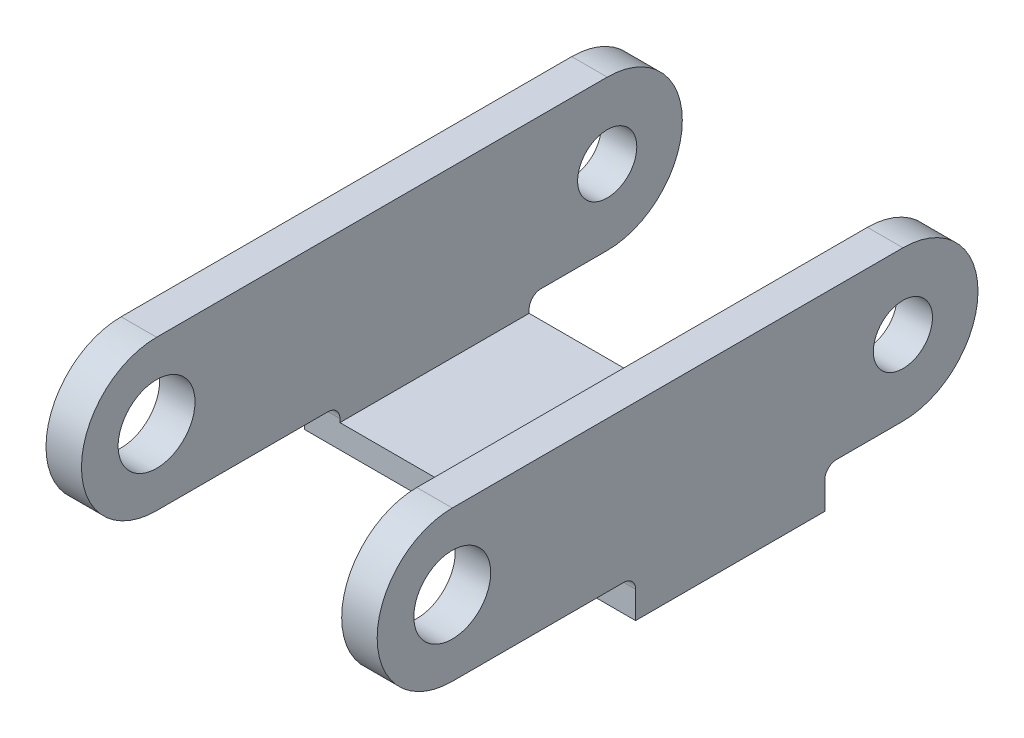
ISO-10303-21;
HEADER;
FILE_DESCRIPTION(('STEP AP214'),'2;1');
FILE_NAME('part.step','',(''),(''),'','','');
FILE_SCHEMA(('AUTOMOTIVE_DESIGN { 1 0 10303 214 1 1 1 1 }'));
ENDSEC;
DATA;
#1=APPLICATION_CONTEXT('core data for automotive mechanical design processes');
#2=APPLICATION_PROTOCOL_DEFINITION('international standard','automotive_design',2000,#1);
#3=PRODUCT_CONTEXT('',#1,'mechanical');
#4=PRODUCT('Part','Part','',(#3));
#5=PRODUCT_RELATED_PRODUCT_CATEGORY('part','',(#4));
#6=PRODUCT_DEFINITION_FORMATION('','',#4);
#7=PRODUCT_DEFINITION_CONTEXT('part definition',#1,'design');
#8=PRODUCT_DEFINITION('design','',#6,#7);
#9=PRODUCT_DEFINITION_SHAPE('','',#8);
#10=(LENGTH_UNIT() NAMED_UNIT(*) SI_UNIT(.MILLI.,.METRE.));
#11=(NAMED_UNIT(*) PLANE_ANGLE_UNIT() SI_UNIT($,.RADIAN.));
#12=(NAMED_UNIT(*) SI_UNIT($,.STERADIAN.) SOLID_ANGLE_UNIT());
#13=UNCERTAINTY_MEASURE_WITH_UNIT(LENGTH_MEASURE(1.E-05),#10,'distance_accuracy_value','');
#14=(GEOMETRIC_REPRESENTATION_CONTEXT(3) GLOBAL_UNCERTAINTY_ASSIGNED_CONTEXT((#13)) GLOBAL_UNIT_ASSIGNED_CONTEXT((#10,
#11,#12)) REPRESENTATION_CONTEXT('',''));
#15=CARTESIAN_POINT('',(0.,0.,0.));
#16=DIRECTION('',(0.,0.,1.));
#17=DIRECTION('',(1.,0.,0.));
#18=AXIS2_PLACEMENT_3D('',#15,#16,#17);
#19=CARTESIAN_POINT('',(3.,-7.35,-32.5));
#20=DIRECTION('',(1.,0.,0.));
#21=DIRECTION('',(0.,0.,-1.));
#22=AXIS2_PLACEMENT_3D('',#19,#20,#21);
#23=PLANE('',#22);
#24=DIRECTION('',(0.,0.,1.));
#25=VECTOR('',#24,1.);
#26=CARTESIAN_POINT('',(3.,-7.65,-31.5));
#27=LINE('',#26,#25);
#28=CARTESIAN_POINT('',(3.,-7.65,-31.5));
#29=VERTEX_POINT('',#28);
#30=CARTESIAN_POINT('',(3.,-7.65,-15.5));
#31=VERTEX_POINT('',#30);
#32=EDGE_CURVE('E48',#29,#31,#27,.T.);
#33=ORIENTED_EDGE('',*,*,#32,.F.);
#34=DIRECTION('',(0.,1.,0.));
#35=VECTOR('',#34,1.);
#36=CARTESIAN_POINT('',(3.,-9.65,-31.5));
#37=LINE('',#36,#35);
#38=CARTESIAN_POINT('',(3.,-7.35000000000001,-31.5));
#39=VERTEX_POINT('',#38);
#40=EDGE_CURVE('E53',#29,#39,#37,.T.);
#41=ORIENTED_EDGE('',*,*,#40,.T.);
#42=CARTESIAN_POINT('',(3.,-7.35,-32.5));
#43=DIRECTION('',(-1.,0.,0.));
#44=DIRECTION('',(0.,0.,-1.));
#45=AXIS2_PLACEMENT_3D('',#42,#43,#44);
#46=CIRCLE('',#45,1.);
#47=CARTESIAN_POINT('',(3.,-6.35,-32.5));
#48=VERTEX_POINT('',#47);
#49=EDGE_CURVE('E168',#39,#48,#46,.T.);
#50=ORIENTED_EDGE('',*,*,#49,.T.);
#51=DIRECTION('',(0.,0.,-1.));
#52=VECTOR('',#51,1.);
#53=CARTESIAN_POINT('',(3.,-6.35,-32.5));
#54=LINE('',#53,#52);
#55=CARTESIAN_POINT('',(3.,-6.35,-38.1));
#56=VERTEX_POINT('',#55);
#57=EDGE_CURVE('E101',#48,#56,#54,.T.);
#58=ORIENTED_EDGE('',*,*,#57,.T.);
#59=CARTESIAN_POINT('',(3.,0.,-38.1));
#60=DIRECTION('',(1.,0.,0.));
#61=DIRECTION('',(0.,0.,-1.));
#62=AXIS2_PLACEMENT_3D('',#59,#60,#61);
#63=CIRCLE('',#62,6.35);
#64=CARTESIAN_POINT('',(3.,6.35,-38.1));
#65=VERTEX_POINT('',#64);
#66=EDGE_CURVE('E188',#56,#65,#63,.T.);
#67=ORIENTED_EDGE('',*,*,#66,.T.);
#68=DIRECTION('',(0.,0.,1.));
#69=VECTOR('',#68,1.);
#70=CARTESIAN_POINT('',(3.,6.35,0.));
#71=LINE('',#70,#69);
#72=CARTESIAN_POINT('',(3.,6.35,0.));
#73=VERTEX_POINT('',#72);
#74=EDGE_CURVE('E201',#65,#73,#71,.T.);
#75=ORIENTED_EDGE('',*,*,#74,.T.);
#76=CARTESIAN_POINT('',(3.,0.,0.));
#77=DIRECTION('',(1.,0.,0.));
#78=DIRECTION('',(0.,0.,-1.));
#79=AXIS2_PLACEMENT_3D('',#76,#77,#78);
#80=CIRCLE('',#79,6.35);
#81=CARTESIAN_POINT('',(3.,-6.35,0.));
#82=VERTEX_POINT('',#81);
#83=EDGE_CURVE('E123',#73,#82,#80,.T.);
#84=ORIENTED_EDGE('',*,*,#83,.T.);
#85=DIRECTION('',(0.,0.,-1.));
#86=VECTOR('',#85,1.);
#87=CARTESIAN_POINT('',(3.,-6.35,0.));
#88=LINE('',#87,#86);
#89=CARTESIAN_POINT('',(3.,-6.35,-14.5));
#90=VERTEX_POINT('',#89);
#91=EDGE_CURVE('E116',#82,#90,#88,.T.);
#92=ORIENTED_EDGE('',*,*,#91,.T.);
#93=CARTESIAN_POINT('',(3.,-7.35,-14.5));
#94=DIRECTION('',(-1.,0.,0.));
#95=DIRECTION('',(0.,0.,-1.));
#96=AXIS2_PLACEMENT_3D('',#93,#94,#95);
#97=CIRCLE('',#96,1.);
#98=CARTESIAN_POINT('',(3.,-7.35000000000001,-15.5));
#99=VERTEX_POINT('',#98);
#100=EDGE_CURVE('E120',#90,#99,#97,.T.);
#101=ORIENTED_EDGE('',*,*,#100,.T.);
#102=DIRECTION('',(0.,-1.,0.));
#103=VECTOR('',#102,1.);
#104=CARTESIAN_POINT('',(3.,-7.35000000000001,-15.5));
#105=LINE('',#104,#103);
#106=EDGE_CURVE('E141',#99,#31,#105,.T.);
#107=ORIENTED_EDGE('',*,*,#106,.T.);
#108=EDGE_LOOP('',(#33,#41,#50,#58,#67,#75,#84,#92,#101,#107));
#109=FACE_BOUND('',#108,.T.);
#110=CARTESIAN_POINT('',(3.,0.,0.));
#111=DIRECTION('',(1.,0.,0.));
#112=DIRECTION('',(0.,0.,-1.));
#113=AXIS2_PLACEMENT_3D('',#110,#111,#112);
#114=CIRCLE('',#113,3.25);
#115=CARTESIAN_POINT('',(3.,0.,-3.25));
#116=VERTEX_POINT('',#115);
#117=EDGE_CURVE('E152',#116,#116,#114,.T.);
#118=ORIENTED_EDGE('',*,*,#117,.F.);
#119=EDGE_LOOP('',(#118));
#120=FACE_BOUND('',#119,.T.);
#121=CARTESIAN_POINT('',(3.,0.,-38.1));
#122=DIRECTION('',(1.,0.,0.));
#123=DIRECTION('',(0.,0.,-1.));
#124=AXIS2_PLACEMENT_3D('',#121,#122,#123);
#125=CIRCLE('',#124,2.5);
#126=CARTESIAN_POINT('',(3.,0.,-40.6));
#127=VERTEX_POINT('',#126);
#128=EDGE_CURVE('E210',#127,#127,#125,.T.);
#129=ORIENTED_EDGE('',*,*,#128,.F.);
#130=EDGE_LOOP('',(#129));
#131=FACE_BOUND('',#130,.T.);
#132=ADVANCED_FACE('F33',(#109,#120,#131),#23,.T.);
#133=CARTESIAN_POINT('',(0.,-7.35,-32.5));
#134=DIRECTION('',(1.,0.,0.));
#135=DIRECTION('',(0.,0.,-1.));
#136=AXIS2_PLACEMENT_3D('',#133,#134,#135);
#137=PLANE('',#136);
#138=CARTESIAN_POINT('',(0.,-7.35,-32.5));
#139=DIRECTION('',(-1.,0.,0.));
#140=DIRECTION('',(0.,0.,-1.));
#141=AXIS2_PLACEMENT_3D('',#138,#139,#140);
#142=CIRCLE('',#141,1.);
#143=CARTESIAN_POINT('',(0.,-7.35000000000001,-31.5));
#144=VERTEX_POINT('',#143);
#145=CARTESIAN_POINT('',(0.,-6.35,-32.5));
#146=VERTEX_POINT('',#145);
#147=EDGE_CURVE('E148',#144,#146,#142,.T.);
#148=ORIENTED_EDGE('',*,*,#147,.F.);
#149=DIRECTION('',(0.,1.,0.));
#150=VECTOR('',#149,1.);
#151=CARTESIAN_POINT('',(0.,-9.65,-31.5));
#152=LINE('',#151,#150);
#153=CARTESIAN_POINT('',(0.,-9.65,-31.5));
#154=VERTEX_POINT('',#153);
#155=EDGE_CURVE('E93',#154,#144,#152,.T.);
#156=ORIENTED_EDGE('',*,*,#155,.F.);
#157=DIRECTION('',(0.,0.,-1.));
#158=VECTOR('',#157,1.);
#159=CARTESIAN_POINT('',(0.,-9.65,-15.5));
#160=LINE('',#159,#158);
#161=CARTESIAN_POINT('',(0.,-9.65,-15.5));
#162=VERTEX_POINT('',#161);
#163=EDGE_CURVE('E165',#162,#154,#160,.T.);
#164=ORIENTED_EDGE('',*,*,#163,.F.);
#165=DIRECTION('',(0.,-1.,0.));
#166=VECTOR('',#165,1.);
#167=CARTESIAN_POINT('',(0.,-7.35000000000001,-15.5));
#168=LINE('',#167,#166);
#169=CARTESIAN_POINT('',(0.,-7.35000000000001,-15.5));
#170=VERTEX_POINT('',#169);
#171=EDGE_CURVE('E163',#170,#162,#168,.T.);
#172=ORIENTED_EDGE('',*,*,#171,.F.);
#173=CARTESIAN_POINT('',(0.,-7.35,-14.5));
#174=DIRECTION('',(-1.,0.,0.));
#175=DIRECTION('',(0.,0.,-1.));
#176=AXIS2_PLACEMENT_3D('',#173,#174,#175);
#177=CIRCLE('',#176,1.);
#178=CARTESIAN_POINT('',(0.,-6.35,-14.5));
#179=VERTEX_POINT('',#178);
#180=EDGE_CURVE('E161',#179,#170,#177,.T.);
#181=ORIENTED_EDGE('',*,*,#180,.F.);
#182=DIRECTION('',(0.,0.,-1.));
#183=VECTOR('',#182,1.);
#184=CARTESIAN_POINT('',(0.,-6.35,0.));
#185=LINE('',#184,#183);
#186=CARTESIAN_POINT('',(0.,-6.35,0.));
#187=VERTEX_POINT('',#186);
#188=EDGE_CURVE('E132',#187,#179,#185,.T.);
#189=ORIENTED_EDGE('',*,*,#188,.F.);
#190=CARTESIAN_POINT('',(0.,0.,0.));
#191=DIRECTION('',(1.,0.,0.));
#192=DIRECTION('',(0.,0.,-1.));
#193=AXIS2_PLACEMENT_3D('',#190,#191,#192);
#194=CIRCLE('',#193,6.35);
#195=CARTESIAN_POINT('',(0.,6.35,0.));
#196=VERTEX_POINT('',#195);
#197=EDGE_CURVE('E158',#196,#187,#194,.T.);
#198=ORIENTED_EDGE('',*,*,#197,.F.);
#199=DIRECTION('',(0.,0.,1.));
#200=VECTOR('',#199,1.);
#201=CARTESIAN_POINT('',(0.,6.35,0.));
#202=LINE('',#201,#200);
#203=CARTESIAN_POINT('',(0.,6.35,-38.1));
#204=VERTEX_POINT('',#203);
#205=EDGE_CURVE('E156',#204,#196,#202,.T.);
#206=ORIENTED_EDGE('',*,*,#205,.F.);
#207=CARTESIAN_POINT('',(0.,0.,-38.1));
#208=DIRECTION('',(1.,0.,0.));
#209=DIRECTION('',(0.,0.,-1.));
#210=AXIS2_PLACEMENT_3D('',#207,#208,#209);
#211=CIRCLE('',#210,6.35);
#212=CARTESIAN_POINT('',(0.,-6.35,-38.1));
#213=VERTEX_POINT('',#212);
#214=EDGE_CURVE('E154',#213,#204,#211,.T.);
#215=ORIENTED_EDGE('',*,*,#214,.F.);
#216=DIRECTION('',(0.,0.,-1.));
#217=VECTOR('',#216,1.);
#218=CARTESIAN_POINT('',(0.,-6.35,-32.5));
#219=LINE('',#218,#217);
#220=EDGE_CURVE('E151',#146,#213,#219,.T.);
#221=ORIENTED_EDGE('',*,*,#220,.F.);
#222=EDGE_LOOP('',(#148,#156,#164,#172,#181,#189,#198,#206,#215,#221));
#223=FACE_BOUND('',#222,.T.);
#224=CARTESIAN_POINT('',(0.,0.,0.));
#225=DIRECTION('',(1.,0.,0.));
#226=DIRECTION('',(0.,0.,-1.));
#227=AXIS2_PLACEMENT_3D('',#224,#225,#226);
#228=CIRCLE('',#227,3.25);
#229=CARTESIAN_POINT('',(0.,0.,-3.25));
#230=VERTEX_POINT('',#229);
#231=EDGE_CURVE('E207',#230,#230,#228,.T.);
#232=ORIENTED_EDGE('',*,*,#231,.T.);
#233=EDGE_LOOP('',(#232));
#234=FACE_BOUND('',#233,.T.);
#235=CARTESIAN_POINT('',(0.,0.,-38.1));
#236=DIRECTION('',(1.,0.,0.));
#237=DIRECTION('',(0.,0.,-1.));
#238=AXIS2_PLACEMENT_3D('',#235,#236,#237);
#239=CIRCLE('',#238,2.5);
#240=CARTESIAN_POINT('',(0.,0.,-40.6));
#241=VERTEX_POINT('',#240);
#242=EDGE_CURVE('E213',#241,#241,#239,.T.);
#243=ORIENTED_EDGE('',*,*,#242,.T.);
#244=EDGE_LOOP('',(#243));
#245=FACE_BOUND('',#244,.T.);
#246=ADVANCED_FACE('F192',(#223,#234,#245),#137,.F.);
#247=CARTESIAN_POINT('',(3.,-7.35,-32.5));
#248=DIRECTION('',(-1.,0.,0.));
#249=DIRECTION('',(0.,0.,1.));
#250=AXIS2_PLACEMENT_3D('',#247,#248,#249);
#251=CYLINDRICAL_SURFACE('',#250,1.);
#252=ORIENTED_EDGE('',*,*,#147,.T.);
#253=DIRECTION('',(-1.,0.,0.));
#254=VECTOR('',#253,1.);
#255=CARTESIAN_POINT('',(3.,-6.35,-32.5));
#256=LINE('',#255,#254);
#257=EDGE_CURVE('E11',#48,#146,#256,.T.);
#258=ORIENTED_EDGE('',*,*,#257,.F.);
#259=ORIENTED_EDGE('',*,*,#49,.F.);
#260=DIRECTION('',(-1.,0.,0.));
#261=VECTOR('',#260,1.);
#262=CARTESIAN_POINT('',(3.,-7.35000000000001,-31.5));
#263=LINE('',#262,#261);
#264=EDGE_CURVE('E147',#39,#144,#263,.T.);
#265=ORIENTED_EDGE('',*,*,#264,.T.);
#266=EDGE_LOOP('',(#252,#258,#259,#265));
#267=FACE_BOUND('',#266,.T.);
#268=ADVANCED_FACE('F35',(#267),#251,.F.);
#269=CARTESIAN_POINT('',(3.,-6.35,-32.5));
#270=DIRECTION('',(0.,1.,0.));
#271=DIRECTION('',(0.,0.,1.));
#272=AXIS2_PLACEMENT_3D('',#269,#270,#271);
#273=PLANE('',#272);
#274=ORIENTED_EDGE('',*,*,#220,.T.);
#275=DIRECTION('',(-1.,0.,0.));
#276=VECTOR('',#275,1.);
#277=CARTESIAN_POINT('',(3.,-6.35,-38.1));
#278=LINE('',#277,#276);
#279=EDGE_CURVE('E41',#56,#213,#278,.T.);
#280=ORIENTED_EDGE('',*,*,#279,.F.);
#281=ORIENTED_EDGE('',*,*,#57,.F.);
#282=ORIENTED_EDGE('',*,*,#257,.T.);
#283=EDGE_LOOP('',(#274,#280,#281,#282));
#284=FACE_BOUND('',#283,.T.);
#285=ADVANCED_FACE('F407',(#284),#273,.F.);
#286=CARTESIAN_POINT('',(3.,0.,-38.1));
#287=DIRECTION('',(-1.,0.,0.));
#288=DIRECTION('',(0.,0.,1.));
#289=AXIS2_PLACEMENT_3D('',#286,#287,#288);
#290=CYLINDRICAL_SURFACE('',#289,6.35);
#291=ORIENTED_EDGE('',*,*,#214,.T.);
#292=DIRECTION('',(-1.,0.,0.));
#293=VECTOR('',#292,1.);
#294=CARTESIAN_POINT('',(3.,6.35,-38.1));
#295=LINE('',#294,#293);
#296=EDGE_CURVE('E180',#65,#204,#295,.T.);
#297=ORIENTED_EDGE('',*,*,#296,.F.);
#298=ORIENTED_EDGE('',*,*,#66,.F.);
#299=ORIENTED_EDGE('',*,*,#279,.T.);
#300=EDGE_LOOP('',(#291,#297,#298,#299));
#301=FACE_BOUND('',#300,.T.);
#302=ADVANCED_FACE('F186',(#301),#290,.T.);
#303=CARTESIAN_POINT('',(3.,6.35,0.));
#304=DIRECTION('',(0.,-1.,0.));
#305=DIRECTION('',(0.,0.,-1.));
#306=AXIS2_PLACEMENT_3D('',#303,#304,#305);
#307=PLANE('',#306);
#308=ORIENTED_EDGE('',*,*,#205,.T.);
#309=DIRECTION('',(-1.,0.,0.));
#310=VECTOR('',#309,1.);
#311=CARTESIAN_POINT('',(3.,6.35,0.));
#312=LINE('',#311,#310);
#313=EDGE_CURVE('E177',#73,#196,#312,.T.);
#314=ORIENTED_EDGE('',*,*,#313,.F.);
#315=ORIENTED_EDGE('',*,*,#74,.F.);
#316=ORIENTED_EDGE('',*,*,#296,.T.);
#317=EDGE_LOOP('',(#308,#314,#315,#316));
#318=FACE_BOUND('',#317,.T.);
#319=ADVANCED_FACE('F197',(#318),#307,.F.);
#320=CARTESIAN_POINT('',(3.,0.,0.));
#321=DIRECTION('',(-1.,0.,0.));
#322=DIRECTION('',(0.,0.,1.));
#323=AXIS2_PLACEMENT_3D('',#320,#321,#322);
#324=CYLINDRICAL_SURFACE('',#323,6.35);
#325=ORIENTED_EDGE('',*,*,#197,.T.);
#326=DIRECTION('',(-1.,0.,0.));
#327=VECTOR('',#326,1.);
#328=CARTESIAN_POINT('',(3.,-6.35,0.));
#329=LINE('',#328,#327);
#330=EDGE_CURVE('E135',#82,#187,#329,.T.);
#331=ORIENTED_EDGE('',*,*,#330,.F.);
#332=ORIENTED_EDGE('',*,*,#83,.F.);
#333=ORIENTED_EDGE('',*,*,#313,.T.);
#334=EDGE_LOOP('',(#325,#331,#332,#333));
#335=FACE_BOUND('',#334,.T.);
#336=ADVANCED_FACE('F200',(#335),#324,.T.);
#337=CARTESIAN_POINT('',(3.,-6.35,0.));
#338=DIRECTION('',(0.,1.,0.));
#339=DIRECTION('',(0.,0.,1.));
#340=AXIS2_PLACEMENT_3D('',#337,#338,#339);
#341=PLANE('',#340);
#342=ORIENTED_EDGE('',*,*,#188,.T.);
#343=DIRECTION('',(-1.,0.,0.));
#344=VECTOR('',#343,1.);
#345=CARTESIAN_POINT('',(3.,-6.35,-14.5));
#346=LINE('',#345,#344);
#347=EDGE_CURVE('E129',#90,#179,#346,.T.);
#348=ORIENTED_EDGE('',*,*,#347,.F.);
#349=ORIENTED_EDGE('',*,*,#91,.F.);
#350=ORIENTED_EDGE('',*,*,#330,.T.);
#351=EDGE_LOOP('',(#342,#348,#349,#350));
#352=FACE_BOUND('',#351,.T.);
#353=ADVANCED_FACE('F130',(#352),#341,.F.);
#354=CARTESIAN_POINT('',(3.,-7.35,-14.5));
#355=DIRECTION('',(-1.,0.,0.));
#356=DIRECTION('',(0.,0.,1.));
#357=AXIS2_PLACEMENT_3D('',#354,#355,#356);
#358=CYLINDRICAL_SURFACE('',#357,1.);
#359=ORIENTED_EDGE('',*,*,#180,.T.);
#360=DIRECTION('',(-1.,0.,0.));
#361=VECTOR('',#360,1.);
#362=CARTESIAN_POINT('',(3.,-7.35000000000001,-15.5));
#363=LINE('',#362,#361);
#364=EDGE_CURVE('E136',#99,#170,#363,.T.);
#365=ORIENTED_EDGE('',*,*,#364,.F.);
#366=ORIENTED_EDGE('',*,*,#100,.F.);
#367=ORIENTED_EDGE('',*,*,#347,.T.);
#368=EDGE_LOOP('',(#359,#365,#366,#367));
#369=FACE_BOUND('',#368,.T.);
#370=ADVANCED_FACE('F138',(#369),#358,.F.);
#371=CARTESIAN_POINT('',(3.,-7.35000000000001,-15.5));
#372=DIRECTION('',(0.,0.,-1.));
#373=DIRECTION('',(-1.,0.,0.));
#374=AXIS2_PLACEMENT_3D('',#371,#372,#373);
#375=PLANE('',#374);
#376=ORIENTED_EDGE('',*,*,#171,.T.);
#377=DIRECTION('',(-1.,0.,0.));
#378=VECTOR('',#377,1.);
#379=CARTESIAN_POINT('',(3.,-9.65,-15.5));
#380=LINE('',#379,#378);
#381=CARTESIAN_POINT('',(28.,-9.65,-15.5));
#382=VERTEX_POINT('',#381);
#383=EDGE_CURVE('E172',#382,#162,#380,.T.);
#384=ORIENTED_EDGE('',*,*,#383,.F.);
#385=DIRECTION('',(0.,-1.,0.));
#386=VECTOR('',#385,1.);
#387=CARTESIAN_POINT('',(28.,-7.35000000000001,-15.5));
#388=LINE('',#387,#386);
#389=CARTESIAN_POINT('',(28.,-7.35000000000001,-15.5));
#390=VERTEX_POINT('',#389);
#391=EDGE_CURVE('E257',#390,#382,#388,.T.);
#392=ORIENTED_EDGE('',*,*,#391,.F.);
#393=DIRECTION('',(1.,0.,0.));
#394=VECTOR('',#393,1.);
#395=CARTESIAN_POINT('',(25.,-7.35000000000001,-15.5));
#396=LINE('',#395,#394);
#397=CARTESIAN_POINT('',(25.,-7.35000000000001,-15.5));
#398=VERTEX_POINT('',#397);
#399=EDGE_CURVE('E243',#398,#390,#396,.T.);
#400=ORIENTED_EDGE('',*,*,#399,.F.);
#401=DIRECTION('',(0.,-1.,0.));
#402=VECTOR('',#401,1.);
#403=CARTESIAN_POINT('',(25.,-7.35000000000001,-15.5));
#404=LINE('',#403,#402);
#405=CARTESIAN_POINT('',(25.,-7.65,-15.5));
#406=VERTEX_POINT('',#405);
#407=EDGE_CURVE('E284',#398,#406,#404,.T.);
#408=ORIENTED_EDGE('',*,*,#407,.T.);
#409=DIRECTION('',(1.,0.,0.));
#410=VECTOR('',#409,1.);
#411=CARTESIAN_POINT('',(3.,-7.65,-15.5));
#412=LINE('',#411,#410);
#413=EDGE_CURVE('E221',#31,#406,#412,.T.);
#414=ORIENTED_EDGE('',*,*,#413,.F.);
#415=ORIENTED_EDGE('',*,*,#106,.F.);
#416=ORIENTED_EDGE('',*,*,#364,.T.);
#417=EDGE_LOOP('',(#376,#384,#392,#400,#408,#414,#415,#416));
#418=FACE_BOUND('',#417,.T.);
#419=ADVANCED_FACE('F429',(#418),#375,.F.);
#420=CARTESIAN_POINT('',(3.,-9.65,-15.5));
#421=DIRECTION('',(0.,1.,0.));
#422=DIRECTION('',(0.,0.,1.));
#423=AXIS2_PLACEMENT_3D('',#420,#421,#422);
#424=PLANE('',#423);
#425=ORIENTED_EDGE('',*,*,#163,.T.);
#426=DIRECTION('',(-1.,0.,0.));
#427=VECTOR('',#426,1.);
#428=CARTESIAN_POINT('',(3.,-9.65,-31.5));
#429=LINE('',#428,#427);
#430=CARTESIAN_POINT('',(28.,-9.65,-31.5));
#431=VERTEX_POINT('',#430);
#432=EDGE_CURVE('E170',#431,#154,#429,.T.);
#433=ORIENTED_EDGE('',*,*,#432,.F.);
#434=DIRECTION('',(0.,0.,-1.));
#435=VECTOR('',#434,1.);
#436=CARTESIAN_POINT('',(28.,-9.65,-15.5));
#437=LINE('',#436,#435);
#438=EDGE_CURVE('E254',#382,#431,#437,.T.);
#439=ORIENTED_EDGE('',*,*,#438,.F.);
#440=ORIENTED_EDGE('',*,*,#383,.T.);
#441=EDGE_LOOP('',(#425,#433,#439,#440));
#442=FACE_BOUND('',#441,.T.);
#443=ADVANCED_FACE('F426',(#442),#424,.F.);
#444=CARTESIAN_POINT('',(3.,-9.65,-31.5));
#445=DIRECTION('',(0.,0.,1.));
#446=DIRECTION('',(0.,-1.,0.));
#447=AXIS2_PLACEMENT_3D('',#444,#445,#446);
#448=PLANE('',#447);
#449=ORIENTED_EDGE('',*,*,#155,.T.);
#450=ORIENTED_EDGE('',*,*,#264,.F.);
#451=ORIENTED_EDGE('',*,*,#40,.F.);
#452=DIRECTION('',(-1.,0.,0.));
#453=VECTOR('',#452,1.);
#454=CARTESIAN_POINT('',(14.,-7.65,-31.5));
#455=LINE('',#454,#453);
#456=CARTESIAN_POINT('',(25.,-7.65,-31.5));
#457=VERTEX_POINT('',#456);
#458=EDGE_CURVE('E216',#457,#29,#455,.T.);
#459=ORIENTED_EDGE('',*,*,#458,.F.);
#460=DIRECTION('',(0.,1.,0.));
#461=VECTOR('',#460,1.);
#462=CARTESIAN_POINT('',(25.,-9.65,-31.5));
#463=LINE('',#462,#461);
#464=CARTESIAN_POINT('',(25.,-7.35000000000001,-31.5));
#465=VERTEX_POINT('',#464);
#466=EDGE_CURVE('E249',#457,#465,#463,.T.);
#467=ORIENTED_EDGE('',*,*,#466,.T.);
#468=DIRECTION('',(1.,0.,0.));
#469=VECTOR('',#468,1.);
#470=CARTESIAN_POINT('',(25.,-7.35000000000001,-31.5));
#471=LINE('',#470,#469);
#472=CARTESIAN_POINT('',(28.,-7.35000000000001,-31.5));
#473=VERTEX_POINT('',#472);
#474=EDGE_CURVE('E246',#465,#473,#471,.T.);
#475=ORIENTED_EDGE('',*,*,#474,.T.);
#476=DIRECTION('',(0.,1.,0.));
#477=VECTOR('',#476,1.);
#478=CARTESIAN_POINT('',(28.,-9.65,-31.5));
#479=LINE('',#478,#477);
#480=EDGE_CURVE('E250',#431,#473,#479,.T.);
#481=ORIENTED_EDGE('',*,*,#480,.F.);
#482=ORIENTED_EDGE('',*,*,#432,.T.);
#483=EDGE_LOOP('',(#449,#450,#451,#459,#467,#475,#481,#482));
#484=FACE_BOUND('',#483,.T.);
#485=ADVANCED_FACE('F400',(#484),#448,.F.);
#486=CARTESIAN_POINT('',(3.,0.,0.));
#487=DIRECTION('',(-1.,0.,0.));
#488=DIRECTION('',(0.,0.,1.));
#489=AXIS2_PLACEMENT_3D('',#486,#487,#488);
#490=CYLINDRICAL_SURFACE('',#489,3.25);
#491=ORIENTED_EDGE('',*,*,#117,.T.);
#492=EDGE_LOOP('',(#491));
#493=FACE_BOUND('',#492,.T.);
#494=ORIENTED_EDGE('',*,*,#231,.F.);
#495=EDGE_LOOP('',(#494));
#496=FACE_BOUND('',#495,.T.);
#497=ADVANCED_FACE('F421',(#493,#496),#490,.F.);
#498=CARTESIAN_POINT('',(3.,0.,-38.1));
#499=DIRECTION('',(-1.,0.,0.));
#500=DIRECTION('',(0.,0.,1.));
#501=AXIS2_PLACEMENT_3D('',#498,#499,#500);
#502=CYLINDRICAL_SURFACE('',#501,2.5);
#503=ORIENTED_EDGE('',*,*,#128,.T.);
#504=EDGE_LOOP('',(#503));
#505=FACE_BOUND('',#504,.T.);
#506=ORIENTED_EDGE('',*,*,#242,.F.);
#507=EDGE_LOOP('',(#506));
#508=FACE_BOUND('',#507,.T.);
#509=ADVANCED_FACE('F481',(#505,#508),#502,.F.);
#510=CARTESIAN_POINT('',(0.,-7.65,0.));
#511=DIRECTION('',(0.,1.,0.));
#512=DIRECTION('',(0.,0.,1.));
#513=AXIS2_PLACEMENT_3D('',#510,#511,#512);
#514=PLANE('',#513);
#515=ORIENTED_EDGE('',*,*,#32,.T.);
#516=ORIENTED_EDGE('',*,*,#413,.T.);
#517=DIRECTION('',(0.,0.,1.));
#518=VECTOR('',#517,1.);
#519=CARTESIAN_POINT('',(25.,-7.65,-31.5));
#520=LINE('',#519,#518);
#521=EDGE_CURVE('E316',#457,#406,#520,.T.);
#522=ORIENTED_EDGE('',*,*,#521,.F.);
#523=ORIENTED_EDGE('',*,*,#458,.T.);
#524=EDGE_LOOP('',(#515,#516,#522,#523));
#525=FACE_BOUND('',#524,.T.);
#526=ADVANCED_FACE('F334',(#525),#514,.T.);
#527=CARTESIAN_POINT('',(25.,-7.35,-32.5));
#528=DIRECTION('',(-1.,0.,0.));
#529=DIRECTION('',(0.,0.,-1.));
#530=AXIS2_PLACEMENT_3D('',#527,#528,#529);
#531=PLANE('',#530);
#532=ORIENTED_EDGE('',*,*,#521,.T.);
#533=ORIENTED_EDGE('',*,*,#407,.F.);
#534=CARTESIAN_POINT('',(25.,-7.35,-14.5));
#535=DIRECTION('',(-1.,0.,0.));
#536=DIRECTION('',(0.,0.,-1.));
#537=AXIS2_PLACEMENT_3D('',#534,#535,#536);
#538=CIRCLE('',#537,1.);
#539=CARTESIAN_POINT('',(25.,-6.35,-14.5));
#540=VERTEX_POINT('',#539);
#541=EDGE_CURVE('E287',#540,#398,#538,.T.);
#542=ORIENTED_EDGE('',*,*,#541,.F.);
#543=DIRECTION('',(0.,0.,-1.));
#544=VECTOR('',#543,1.);
#545=CARTESIAN_POINT('',(25.,-6.35,0.));
#546=LINE('',#545,#544);
#547=CARTESIAN_POINT('',(25.,-6.35,0.));
#548=VERTEX_POINT('',#547);
#549=EDGE_CURVE('E290',#548,#540,#546,.T.);
#550=ORIENTED_EDGE('',*,*,#549,.F.);
#551=CARTESIAN_POINT('',(25.,0.,0.));
#552=DIRECTION('',(1.,0.,0.));
#553=DIRECTION('',(0.,0.,-1.));
#554=AXIS2_PLACEMENT_3D('',#551,#552,#553);
#555=CIRCLE('',#554,6.35);
#556=CARTESIAN_POINT('',(25.,6.35,0.));
#557=VERTEX_POINT('',#556);
#558=EDGE_CURVE('E293',#557,#548,#555,.T.);
#559=ORIENTED_EDGE('',*,*,#558,.F.);
#560=DIRECTION('',(0.,0.,1.));
#561=VECTOR('',#560,1.);
#562=CARTESIAN_POINT('',(25.,6.35,0.));
#563=LINE('',#562,#561);
#564=CARTESIAN_POINT('',(25.,6.35,-38.1));
#565=VERTEX_POINT('',#564);
#566=EDGE_CURVE('E296',#565,#557,#563,.T.);
#567=ORIENTED_EDGE('',*,*,#566,.F.);
#568=CARTESIAN_POINT('',(25.,0.,-38.1));
#569=DIRECTION('',(1.,0.,0.));
#570=DIRECTION('',(0.,0.,-1.));
#571=AXIS2_PLACEMENT_3D('',#568,#569,#570);
#572=CIRCLE('',#571,6.35);
#573=CARTESIAN_POINT('',(25.,-6.35,-38.1));
#574=VERTEX_POINT('',#573);
#575=EDGE_CURVE('E299',#574,#565,#572,.T.);
#576=ORIENTED_EDGE('',*,*,#575,.F.);
#577=DIRECTION('',(0.,0.,-1.));
#578=VECTOR('',#577,1.);
#579=CARTESIAN_POINT('',(25.,-6.35,-32.5));
#580=LINE('',#579,#578);
#581=CARTESIAN_POINT('',(25.,-6.35,-32.5));
#582=VERTEX_POINT('',#581);
#583=EDGE_CURVE('E302',#582,#574,#580,.T.);
#584=ORIENTED_EDGE('',*,*,#583,.F.);
#585=CARTESIAN_POINT('',(25.,-7.35,-32.5));
#586=DIRECTION('',(-1.,0.,0.));
#587=DIRECTION('',(0.,0.,-1.));
#588=AXIS2_PLACEMENT_3D('',#585,#586,#587);
#589=CIRCLE('',#588,1.);
#590=EDGE_CURVE('E253',#465,#582,#589,.T.);
#591=ORIENTED_EDGE('',*,*,#590,.F.);
#592=ORIENTED_EDGE('',*,*,#466,.F.);
#593=EDGE_LOOP('',(#532,#533,#542,#550,#559,#567,#576,#584,#591,#592));
#594=FACE_BOUND('',#593,.T.);
#595=CARTESIAN_POINT('',(25.,0.,0.));
#596=DIRECTION('',(1.,0.,0.));
#597=DIRECTION('',(0.,0.,-1.));
#598=AXIS2_PLACEMENT_3D('',#595,#596,#597);
#599=CIRCLE('',#598,3.25);
#600=CARTESIAN_POINT('',(25.,0.,-3.25));
#601=VERTEX_POINT('',#600);
#602=EDGE_CURVE('E281',#601,#601,#599,.T.);
#603=ORIENTED_EDGE('',*,*,#602,.T.);
#604=EDGE_LOOP('',(#603));
#605=FACE_BOUND('',#604,.T.);
#606=CARTESIAN_POINT('',(25.,0.,-38.1));
#607=DIRECTION('',(1.,0.,0.));
#608=DIRECTION('',(0.,0.,-1.));
#609=AXIS2_PLACEMENT_3D('',#606,#607,#608);
#610=CIRCLE('',#609,2.5);
#611=CARTESIAN_POINT('',(25.,0.,-40.6));
#612=VERTEX_POINT('',#611);
#613=EDGE_CURVE('E310',#612,#612,#610,.T.);
#614=ORIENTED_EDGE('',*,*,#613,.T.);
#615=EDGE_LOOP('',(#614));
#616=FACE_BOUND('',#615,.T.);
#617=ADVANCED_FACE('F325',(#594,#605,#616),#531,.T.);
#618=CARTESIAN_POINT('',(28.,-7.35,-32.5));
#619=DIRECTION('',(-1.,0.,0.));
#620=DIRECTION('',(0.,0.,-1.));
#621=AXIS2_PLACEMENT_3D('',#618,#619,#620);
#622=PLANE('',#621);
#623=CARTESIAN_POINT('',(28.,-7.35,-32.5));
#624=DIRECTION('',(-1.,0.,0.));
#625=DIRECTION('',(0.,0.,-1.));
#626=AXIS2_PLACEMENT_3D('',#623,#624,#625);
#627=CIRCLE('',#626,1.);
#628=CARTESIAN_POINT('',(28.,-6.35,-32.5));
#629=VERTEX_POINT('',#628);
#630=EDGE_CURVE('E278',#473,#629,#627,.T.);
#631=ORIENTED_EDGE('',*,*,#630,.T.);
#632=DIRECTION('',(0.,0.,-1.));
#633=VECTOR('',#632,1.);
#634=CARTESIAN_POINT('',(28.,-6.35,-32.5));
#635=LINE('',#634,#633);
#636=CARTESIAN_POINT('',(28.,-6.35,-38.1));
#637=VERTEX_POINT('',#636);
#638=EDGE_CURVE('E275',#629,#637,#635,.T.);
#639=ORIENTED_EDGE('',*,*,#638,.T.);
#640=CARTESIAN_POINT('',(28.,0.,-38.1));
#641=DIRECTION('',(1.,0.,0.));
#642=DIRECTION('',(0.,0.,-1.));
#643=AXIS2_PLACEMENT_3D('',#640,#641,#642);
#644=CIRCLE('',#643,6.35);
#645=CARTESIAN_POINT('',(28.,6.35,-38.1));
#646=VERTEX_POINT('',#645);
#647=EDGE_CURVE('E272',#637,#646,#644,.T.);
#648=ORIENTED_EDGE('',*,*,#647,.T.);
#649=DIRECTION('',(0.,0.,1.));
#650=VECTOR('',#649,1.);
#651=CARTESIAN_POINT('',(28.,6.35,0.));
#652=LINE('',#651,#650);
#653=CARTESIAN_POINT('',(28.,6.35,0.));
#654=VERTEX_POINT('',#653);
#655=EDGE_CURVE('E269',#646,#654,#652,.T.);
#656=ORIENTED_EDGE('',*,*,#655,.T.);
#657=CARTESIAN_POINT('',(28.,0.,0.));
#658=DIRECTION('',(1.,0.,0.));
#659=DIRECTION('',(0.,0.,-1.));
#660=AXIS2_PLACEMENT_3D('',#657,#658,#659);
#661=CIRCLE('',#660,6.35);
#662=CARTESIAN_POINT('',(28.,-6.35,0.));
#663=VERTEX_POINT('',#662);
#664=EDGE_CURVE('E266',#654,#663,#661,.T.);
#665=ORIENTED_EDGE('',*,*,#664,.T.);
#666=DIRECTION('',(0.,0.,-1.));
#667=VECTOR('',#666,1.);
#668=CARTESIAN_POINT('',(28.,-6.35,0.));
#669=LINE('',#668,#667);
#670=CARTESIAN_POINT('',(28.,-6.35,-14.5));
#671=VERTEX_POINT('',#670);
#672=EDGE_CURVE('E263',#663,#671,#669,.T.);
#673=ORIENTED_EDGE('',*,*,#672,.T.);
#674=CARTESIAN_POINT('',(28.,-7.35,-14.5));
#675=DIRECTION('',(-1.,0.,0.));
#676=DIRECTION('',(0.,0.,-1.));
#677=AXIS2_PLACEMENT_3D('',#674,#675,#676);
#678=CIRCLE('',#677,1.);
#679=EDGE_CURVE('E260',#671,#390,#678,.T.);
#680=ORIENTED_EDGE('',*,*,#679,.T.);
#681=ORIENTED_EDGE('',*,*,#391,.T.);
#682=ORIENTED_EDGE('',*,*,#438,.T.);
#683=ORIENTED_EDGE('',*,*,#480,.T.);
#684=EDGE_LOOP('',(#631,#639,#648,#656,#665,#673,#680,#681,#682,#683));
#685=FACE_BOUND('',#684,.T.);
#686=CARTESIAN_POINT('',(28.,0.,0.));
#687=DIRECTION('',(1.,0.,0.));
#688=DIRECTION('',(0.,0.,-1.));
#689=AXIS2_PLACEMENT_3D('',#686,#687,#688);
#690=CIRCLE('',#689,3.25);
#691=CARTESIAN_POINT('',(28.,0.,-3.25));
#692=VERTEX_POINT('',#691);
#693=EDGE_CURVE('E307',#692,#692,#690,.T.);
#694=ORIENTED_EDGE('',*,*,#693,.F.);
#695=EDGE_LOOP('',(#694));
#696=FACE_BOUND('',#695,.T.);
#697=CARTESIAN_POINT('',(28.,0.,-38.1));
#698=DIRECTION('',(1.,0.,0.));
#699=DIRECTION('',(0.,0.,-1.));
#700=AXIS2_PLACEMENT_3D('',#697,#698,#699);
#701=CIRCLE('',#700,2.5);
#702=CARTESIAN_POINT('',(28.,0.,-40.6));
#703=VERTEX_POINT('',#702);
#704=EDGE_CURVE('E313',#703,#703,#701,.T.);
#705=ORIENTED_EDGE('',*,*,#704,.F.);
#706=EDGE_LOOP('',(#705));
#707=FACE_BOUND('',#706,.T.);
#708=ADVANCED_FACE('F396',(#685,#696,#707),#622,.F.);
#709=CARTESIAN_POINT('',(25.,-7.35,-32.5));
#710=DIRECTION('',(1.,0.,0.));
#711=DIRECTION('',(0.,0.,1.));
#712=AXIS2_PLACEMENT_3D('',#709,#710,#711);
#713=CYLINDRICAL_SURFACE('',#712,1.);
#714=ORIENTED_EDGE('',*,*,#630,.F.);
#715=ORIENTED_EDGE('',*,*,#474,.F.);
#716=ORIENTED_EDGE('',*,*,#590,.T.);
#717=DIRECTION('',(1.,0.,0.));
#718=VECTOR('',#717,1.);
#719=CARTESIAN_POINT('',(25.,-6.35,-32.5));
#720=LINE('',#719,#718);
#721=EDGE_CURVE('E225',#582,#629,#720,.T.);
#722=ORIENTED_EDGE('',*,*,#721,.T.);
#723=EDGE_LOOP('',(#714,#715,#716,#722));
#724=FACE_BOUND('',#723,.T.);
#725=ADVANCED_FACE('F388',(#724),#713,.F.);
#726=CARTESIAN_POINT('',(25.,-6.35,-32.5));
#727=DIRECTION('',(0.,1.,0.));
#728=DIRECTION('',(0.,0.,1.));
#729=AXIS2_PLACEMENT_3D('',#726,#727,#728);
#730=PLANE('',#729);
#731=ORIENTED_EDGE('',*,*,#638,.F.);
#732=ORIENTED_EDGE('',*,*,#721,.F.);
#733=ORIENTED_EDGE('',*,*,#583,.T.);
#734=DIRECTION('',(1.,0.,0.));
#735=VECTOR('',#734,1.);
#736=CARTESIAN_POINT('',(25.,-6.35,-38.1));
#737=LINE('',#736,#735);
#738=EDGE_CURVE('E228',#574,#637,#737,.T.);
#739=ORIENTED_EDGE('',*,*,#738,.T.);
#740=EDGE_LOOP('',(#731,#732,#733,#739));
#741=FACE_BOUND('',#740,.T.);
#742=ADVANCED_FACE('F383',(#741),#730,.F.);
#743=CARTESIAN_POINT('',(25.,0.,-38.1));
#744=DIRECTION('',(1.,0.,0.));
#745=DIRECTION('',(0.,0.,1.));
#746=AXIS2_PLACEMENT_3D('',#743,#744,#745);
#747=CYLINDRICAL_SURFACE('',#746,6.35);
#748=ORIENTED_EDGE('',*,*,#647,.F.);
#749=ORIENTED_EDGE('',*,*,#738,.F.);
#750=ORIENTED_EDGE('',*,*,#575,.T.);
#751=DIRECTION('',(1.,0.,0.));
#752=VECTOR('',#751,1.);
#753=CARTESIAN_POINT('',(25.,6.35,-38.1));
#754=LINE('',#753,#752);
#755=EDGE_CURVE('E231',#565,#646,#754,.T.);
#756=ORIENTED_EDGE('',*,*,#755,.T.);
#757=EDGE_LOOP('',(#748,#749,#750,#756));
#758=FACE_BOUND('',#757,.T.);
#759=ADVANCED_FACE('F393',(#758),#747,.T.);
#760=CARTESIAN_POINT('',(25.,6.35,0.));
#761=DIRECTION('',(0.,-1.,0.));
#762=DIRECTION('',(0.,0.,-1.));
#763=AXIS2_PLACEMENT_3D('',#760,#761,#762);
#764=PLANE('',#763);
#765=ORIENTED_EDGE('',*,*,#655,.F.);
#766=ORIENTED_EDGE('',*,*,#755,.F.);
#767=ORIENTED_EDGE('',*,*,#566,.T.);
#768=DIRECTION('',(1.,0.,0.));
#769=VECTOR('',#768,1.);
#770=CARTESIAN_POINT('',(25.,6.35,0.));
#771=LINE('',#770,#769);
#772=EDGE_CURVE('E234',#557,#654,#771,.T.);
#773=ORIENTED_EDGE('',*,*,#772,.T.);
#774=EDGE_LOOP('',(#765,#766,#767,#773));
#775=FACE_BOUND('',#774,.T.);
#776=ADVANCED_FACE('F525',(#775),#764,.F.);
#777=CARTESIAN_POINT('',(25.,0.,0.));
#778=DIRECTION('',(1.,0.,0.));
#779=DIRECTION('',(0.,0.,1.));
#780=AXIS2_PLACEMENT_3D('',#777,#778,#779);
#781=CYLINDRICAL_SURFACE('',#780,6.35);
#782=ORIENTED_EDGE('',*,*,#664,.F.);
#783=ORIENTED_EDGE('',*,*,#772,.F.);
#784=ORIENTED_EDGE('',*,*,#558,.T.);
#785=DIRECTION('',(1.,0.,0.));
#786=VECTOR('',#785,1.);
#787=CARTESIAN_POINT('',(25.,-6.35,0.));
#788=LINE('',#787,#786);
#789=EDGE_CURVE('E237',#548,#663,#788,.T.);
#790=ORIENTED_EDGE('',*,*,#789,.T.);
#791=EDGE_LOOP('',(#782,#783,#784,#790));
#792=FACE_BOUND('',#791,.T.);
#793=ADVANCED_FACE('F532',(#792),#781,.T.);
#794=CARTESIAN_POINT('',(25.,-6.35,0.));
#795=DIRECTION('',(0.,1.,0.));
#796=DIRECTION('',(0.,0.,1.));
#797=AXIS2_PLACEMENT_3D('',#794,#795,#796);
#798=PLANE('',#797);
#799=ORIENTED_EDGE('',*,*,#672,.F.);
#800=ORIENTED_EDGE('',*,*,#789,.F.);
#801=ORIENTED_EDGE('',*,*,#549,.T.);
#802=DIRECTION('',(1.,0.,0.));
#803=VECTOR('',#802,1.);
#804=CARTESIAN_POINT('',(25.,-6.35,-14.5));
#805=LINE('',#804,#803);
#806=EDGE_CURVE('E240',#540,#671,#805,.T.);
#807=ORIENTED_EDGE('',*,*,#806,.T.);
#808=EDGE_LOOP('',(#799,#800,#801,#807));
#809=FACE_BOUND('',#808,.T.);
#810=ADVANCED_FACE('F540',(#809),#798,.F.);
#811=CARTESIAN_POINT('',(25.,-7.35,-14.5));
#812=DIRECTION('',(1.,0.,0.));
#813=DIRECTION('',(0.,0.,1.));
#814=AXIS2_PLACEMENT_3D('',#811,#812,#813);
#815=CYLINDRICAL_SURFACE('',#814,1.);
#816=ORIENTED_EDGE('',*,*,#679,.F.);
#817=ORIENTED_EDGE('',*,*,#806,.F.);
#818=ORIENTED_EDGE('',*,*,#541,.T.);
#819=ORIENTED_EDGE('',*,*,#399,.T.);
#820=EDGE_LOOP('',(#816,#817,#818,#819));
#821=FACE_BOUND('',#820,.T.);
#822=ADVANCED_FACE('F548',(#821),#815,.F.);
#823=CARTESIAN_POINT('',(25.,0.,0.));
#824=DIRECTION('',(1.,0.,0.));
#825=DIRECTION('',(0.,0.,1.));
#826=AXIS2_PLACEMENT_3D('',#823,#824,#825);
#827=CYLINDRICAL_SURFACE('',#826,3.25);
#828=ORIENTED_EDGE('',*,*,#602,.F.);
#829=EDGE_LOOP('',(#828));
#830=FACE_BOUND('',#829,.T.);
#831=ORIENTED_EDGE('',*,*,#693,.T.);
#832=EDGE_LOOP('',(#831));
#833=FACE_BOUND('',#832,.T.);
#834=ADVANCED_FACE('F556',(#830,#833),#827,.F.);
#835=CARTESIAN_POINT('',(25.,0.,-38.1));
#836=DIRECTION('',(1.,0.,0.));
#837=DIRECTION('',(0.,0.,1.));
#838=AXIS2_PLACEMENT_3D('',#835,#836,#837);
#839=CYLINDRICAL_SURFACE('',#838,2.5);
#840=ORIENTED_EDGE('',*,*,#613,.F.);
#841=EDGE_LOOP('',(#840));
#842=FACE_BOUND('',#841,.T.);
#843=ORIENTED_EDGE('',*,*,#704,.T.);
#844=EDGE_LOOP('',(#843));
#845=FACE_BOUND('',#844,.T.);
#846=ADVANCED_FACE('F564',(#842,#845),#839,.F.);
#847=CLOSED_SHELL('',(#132,#246,#268,#285,#302,#319,#336,#353,#370,#419,#443,#485,#497,#509,
#526,#617,#708,#725,#742,#759,#776,#793,#810,#822,#834,#846));
#848=MANIFOLD_SOLID_BREP('B2',#847);
#849=ADVANCED_BREP_SHAPE_REPRESENTATION('',(#18,#848),#14);
#850=SHAPE_DEFINITION_REPRESENTATION(#9,#849);
ENDSEC;
END-ISO-10303-21;
